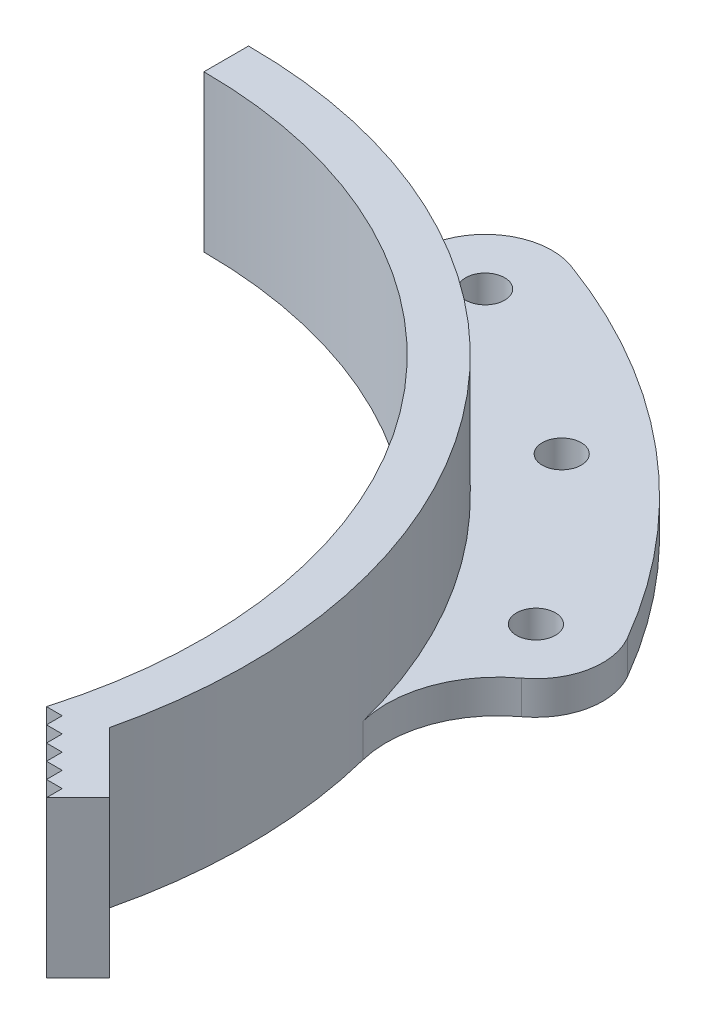
ISO-10303-21;
HEADER;
FILE_DESCRIPTION(('STEP AP214'),'2;1');
FILE_NAME('part.step','',(''),(''),'','','');
FILE_SCHEMA(('AUTOMOTIVE_DESIGN { 1 0 10303 214 1 1 1 1 }'));
ENDSEC;
DATA;
#1=APPLICATION_CONTEXT('core data for automotive mechanical design processes');
#2=APPLICATION_PROTOCOL_DEFINITION('international standard','automotive_design',2000,#1);
#3=PRODUCT_CONTEXT('',#1,'mechanical');
#4=PRODUCT('Part','Part','',(#3));
#5=PRODUCT_RELATED_PRODUCT_CATEGORY('part','',(#4));
#6=PRODUCT_DEFINITION_FORMATION('','',#4);
#7=PRODUCT_DEFINITION_CONTEXT('part definition',#1,'design');
#8=PRODUCT_DEFINITION('design','',#6,#7);
#9=PRODUCT_DEFINITION_SHAPE('','',#8);
#10=(LENGTH_UNIT() NAMED_UNIT(*) SI_UNIT(.MILLI.,.METRE.));
#11=(NAMED_UNIT(*) PLANE_ANGLE_UNIT() SI_UNIT($,.RADIAN.));
#12=(NAMED_UNIT(*) SI_UNIT($,.STERADIAN.) SOLID_ANGLE_UNIT());
#13=UNCERTAINTY_MEASURE_WITH_UNIT(LENGTH_MEASURE(1.E-05),#10,'distance_accuracy_value','');
#14=(GEOMETRIC_REPRESENTATION_CONTEXT(3) GLOBAL_UNCERTAINTY_ASSIGNED_CONTEXT((#13)) GLOBAL_UNIT_ASSIGNED_CONTEXT((#10,
#11,#12)) REPRESENTATION_CONTEXT('',''));
#15=CARTESIAN_POINT('',(0.,0.,0.));
#16=DIRECTION('',(0.,0.,1.));
#17=DIRECTION('',(1.,0.,0.));
#18=AXIS2_PLACEMENT_3D('',#15,#16,#17);
#19=CARTESIAN_POINT('',(0.,3.,0.));
#20=DIRECTION('',(0.,1.,0.));
#21=DIRECTION('',(0.,0.,1.));
#22=AXIS2_PLACEMENT_3D('',#19,#20,#21);
#23=PLANE('',#22);
#24=CARTESIAN_POINT('',(18.4690877395862,3.,-50.743401522439));
#25=DIRECTION('',(0.,1.,0.));
#26=DIRECTION('',(0.,0.,1.));
#27=AXIS2_PLACEMENT_3D('',#24,#25,#26);
#28=CIRCLE('',#27,1.75);
#29=CARTESIAN_POINT('',(18.4690877395862,3.,-48.993401522439));
#30=VERTEX_POINT('',#29);
#31=EDGE_CURVE('E311',#30,#30,#28,.T.);
#32=ORIENTED_EDGE('',*,*,#31,.F.);
#33=EDGE_LOOP('',(#32));
#34=FACE_BOUND('',#33,.T.);
#35=CARTESIAN_POINT('',(0.,3.,0.));
#36=DIRECTION('',(0.,-1.,0.));
#37=DIRECTION('',(0.,0.,1.));
#38=AXIS2_PLACEMENT_3D('',#35,#36,#37);
#39=CIRCLE('',#38,48.);
#40=CARTESIAN_POINT('',(0.,3.,-48.));
#41=VERTEX_POINT('',#40);
#42=CARTESIAN_POINT('',(46.5562232625086,3.,-11.6840949812748));
#43=VERTEX_POINT('',#42);
#44=EDGE_CURVE('E49',#41,#43,#39,.T.);
#45=ORIENTED_EDGE('',*,*,#44,.T.);
#46=CARTESIAN_POINT('',(56.2554364421979,3.,-14.1182814357071));
#47=DIRECTION('',(0.,1.,0.));
#48=DIRECTION('',(0.,0.,1.));
#49=AXIS2_PLACEMENT_3D('',#46,#47,#48);
#50=CIRCLE('',#49,10.);
#51=CARTESIAN_POINT('',(50.324146043549,3.,-22.1693555383902));
#52=VERTEX_POINT('',#51);
#53=EDGE_CURVE('E11',#43,#52,#50,.F.);
#54=ORIENTED_EDGE('',*,*,#53,.T.);
#55=CARTESIAN_POINT('',(46.7653718043596,3.,-27.0000000000001));
#56=DIRECTION('',(0.,1.,0.));
#57=DIRECTION('',(0.,0.,1.));
#58=AXIS2_PLACEMENT_3D('',#55,#56,#57);
#59=CIRCLE('',#58,6.);
#60=CARTESIAN_POINT('',(51.9615242270663,3.,-30.0000000000001));
#61=VERTEX_POINT('',#60);
#62=EDGE_CURVE('E324',#52,#61,#59,.T.);
#63=ORIENTED_EDGE('',*,*,#62,.T.);
#64=CARTESIAN_POINT('',(0.,3.,0.));
#65=DIRECTION('',(0.,1.,0.));
#66=DIRECTION('',(0.,0.,1.));
#67=AXIS2_PLACEMENT_3D('',#64,#65,#66);
#68=CIRCLE('',#67,60.);
#69=CARTESIAN_POINT('',(20.5212085995402,3.,-56.3815572471545));
#70=VERTEX_POINT('',#69);
#71=EDGE_CURVE('E327',#61,#70,#68,.T.);
#72=ORIENTED_EDGE('',*,*,#71,.T.);
#73=CARTESIAN_POINT('',(18.4690877395862,3.,-50.743401522439));
#74=DIRECTION('',(0.,1.,0.));
#75=DIRECTION('',(0.,0.,1.));
#76=AXIS2_PLACEMENT_3D('',#73,#74,#75);
#77=CIRCLE('',#76,6.);
#78=CARTESIAN_POINT('',(12.4748076536375,3.,-50.4814735720417));
#79=VERTEX_POINT('',#78);
#80=EDGE_CURVE('E329',#70,#79,#77,.T.);
#81=ORIENTED_EDGE('',*,*,#80,.T.);
#82=CARTESIAN_POINT('',(0.,3.,0.));
#83=DIRECTION('',(0.,1.,0.));
#84=DIRECTION('',(0.,0.,1.));
#85=AXIS2_PLACEMENT_3D('',#82,#83,#84);
#86=CIRCLE('',#85,52.);
#87=CARTESIAN_POINT('',(0.,3.,-52.));
#88=VERTEX_POINT('',#87);
#89=EDGE_CURVE('E331',#79,#88,#86,.T.);
#90=ORIENTED_EDGE('',*,*,#89,.T.);
#91=DIRECTION('',(0.,0.,1.));
#92=VECTOR('',#91,1.);
#93=CARTESIAN_POINT('',(0.,3.,-48.));
#94=LINE('',#93,#92);
#95=EDGE_CURVE('E333',#88,#41,#94,.T.);
#96=ORIENTED_EDGE('',*,*,#95,.T.);
#97=EDGE_LOOP('',(#45,#54,#63,#72,#81,#90,#96));
#98=FACE_BOUND('',#97,.T.);
#99=CARTESIAN_POINT('',(34.7105309230731,3.,-41.3663999284248));
#100=DIRECTION('',(0.,1.,0.));
#101=DIRECTION('',(0.,0.,1.));
#102=AXIS2_PLACEMENT_3D('',#99,#100,#101);
#103=CIRCLE('',#102,1.75);
#104=CARTESIAN_POINT('',(34.7105309230731,3.,-39.6163999284248));
#105=VERTEX_POINT('',#104);
#106=EDGE_CURVE('E317',#105,#105,#103,.T.);
#107=ORIENTED_EDGE('',*,*,#106,.F.);
#108=EDGE_LOOP('',(#107));
#109=FACE_BOUND('',#108,.T.);
#110=CARTESIAN_POINT('',(46.7653718043596,3.,-27.0000000000001));
#111=DIRECTION('',(0.,1.,0.));
#112=DIRECTION('',(0.,0.,1.));
#113=AXIS2_PLACEMENT_3D('',#110,#111,#112);
#114=CIRCLE('',#113,1.74999999999998);
#115=CARTESIAN_POINT('',(46.7653718043596,3.,-25.2500000000001));
#116=VERTEX_POINT('',#115);
#117=EDGE_CURVE('E305',#116,#116,#114,.T.);
#118=ORIENTED_EDGE('',*,*,#117,.F.);
#119=EDGE_LOOP('',(#118));
#120=FACE_BOUND('',#119,.T.);
#121=ADVANCED_FACE('F35',(#34,#98,#109,#120),#23,.T.);
#122=CARTESIAN_POINT('',(0.,0.,0.));
#123=DIRECTION('',(0.,1.,0.));
#124=DIRECTION('',(0.,0.,1.));
#125=AXIS2_PLACEMENT_3D('',#122,#123,#124);
#126=PLANE('',#125);
#127=CARTESIAN_POINT('',(46.7653718043596,0.,-27.0000000000001));
#128=DIRECTION('',(0.,1.,0.));
#129=DIRECTION('',(0.,0.,1.));
#130=AXIS2_PLACEMENT_3D('',#127,#128,#129);
#131=CIRCLE('',#130,6.);
#132=CARTESIAN_POINT('',(50.324146043549,0.,-22.1693555383902));
#133=VERTEX_POINT('',#132);
#134=CARTESIAN_POINT('',(51.9615242270663,0.,-30.0000000000001));
#135=VERTEX_POINT('',#134);
#136=EDGE_CURVE('E320',#133,#135,#131,.T.);
#137=ORIENTED_EDGE('',*,*,#136,.F.);
#138=CARTESIAN_POINT('',(56.2554364421979,0.,-14.1182814357071));
#139=DIRECTION('',(0.,1.,0.));
#140=DIRECTION('',(0.,0.,1.));
#141=AXIS2_PLACEMENT_3D('',#138,#139,#140);
#142=CIRCLE('',#141,10.);
#143=CARTESIAN_POINT('',(46.5562232625086,0.,-11.6840949812748));
#144=VERTEX_POINT('',#143);
#145=EDGE_CURVE('E43',#133,#144,#142,.T.);
#146=ORIENTED_EDGE('',*,*,#145,.T.);
#147=CARTESIAN_POINT('',(0.,0.,0.));
#148=DIRECTION('',(0.,1.,0.));
#149=DIRECTION('',(0.,0.,1.));
#150=AXIS2_PLACEMENT_3D('',#147,#148,#149);
#151=CIRCLE('',#150,48.);
#152=CARTESIAN_POINT('',(46.6876836873935,0.,11.1472055648891));
#153=VERTEX_POINT('',#152);
#154=EDGE_CURVE('E189',#153,#144,#151,.T.);
#155=ORIENTED_EDGE('',*,*,#154,.F.);
#156=DIRECTION('',(-0.707106781186548,0.,-0.707106781186547));
#157=VECTOR('',#156,1.);
#158=CARTESIAN_POINT('',(52.1312730888183,0.,16.590794966314));
#159=LINE('',#158,#157);
#160=CARTESIAN_POINT('',(52.1312730888183,0.,16.590794966314));
#161=VERTEX_POINT('',#160);
#162=EDGE_CURVE('E273',#161,#153,#159,.T.);
#163=ORIENTED_EDGE('',*,*,#162,.F.);
#164=DIRECTION('',(0.707106781186547,0.,-0.707106781186548));
#165=VECTOR('',#164,1.);
#166=CARTESIAN_POINT('',(49.3028459640721,0.,19.4192220910602));
#167=LINE('',#166,#165);
#168=CARTESIAN_POINT('',(49.3028459640721,0.,19.4192220910602));
#169=VERTEX_POINT('',#168);
#170=EDGE_CURVE('E270',#169,#161,#167,.T.);
#171=ORIENTED_EDGE('',*,*,#170,.F.);
#172=DIRECTION('',(0.,0.,1.));
#173=VECTOR('',#172,1.);
#174=CARTESIAN_POINT('',(49.3028459640721,0.,19.4192220910602));
#175=LINE('',#174,#173);
#176=CARTESIAN_POINT('',(49.3028459640721,0.,18.0050085286871));
#177=VERTEX_POINT('',#176);
#178=EDGE_CURVE('E267',#177,#169,#175,.T.);
#179=ORIENTED_EDGE('',*,*,#178,.F.);
#180=DIRECTION('',(1.,0.,0.));
#181=VECTOR('',#180,1.);
#182=CARTESIAN_POINT('',(49.3028459640721,0.,18.0050085286871));
#183=LINE('',#182,#181);
#184=CARTESIAN_POINT('',(47.888632401699,0.,18.0050085286871));
#185=VERTEX_POINT('',#184);
#186=EDGE_CURVE('E264',#185,#177,#183,.T.);
#187=ORIENTED_EDGE('',*,*,#186,.F.);
#188=DIRECTION('',(0.,0.,1.));
#189=VECTOR('',#188,1.);
#190=CARTESIAN_POINT('',(47.888632401699,0.,18.0050085286871));
#191=LINE('',#190,#189);
#192=CARTESIAN_POINT('',(47.888632401699,0.,16.590794966314));
#193=VERTEX_POINT('',#192);
#194=EDGE_CURVE('E261',#193,#185,#191,.T.);
#195=ORIENTED_EDGE('',*,*,#194,.F.);
#196=DIRECTION('',(1.,0.,0.));
#197=VECTOR('',#196,1.);
#198=CARTESIAN_POINT('',(47.888632401699,0.,16.590794966314));
#199=LINE('',#198,#197);
#200=CARTESIAN_POINT('',(46.474418839326,0.,16.590794966314));
#201=VERTEX_POINT('',#200);
#202=EDGE_CURVE('E258',#201,#193,#199,.T.);
#203=ORIENTED_EDGE('',*,*,#202,.F.);
#204=DIRECTION('',(0.,0.,1.));
#205=VECTOR('',#204,1.);
#206=CARTESIAN_POINT('',(46.474418839326,0.,16.590794966314));
#207=LINE('',#206,#205);
#208=CARTESIAN_POINT('',(46.474418839326,0.,15.1765814039409));
#209=VERTEX_POINT('',#208);
#210=EDGE_CURVE('E255',#209,#201,#207,.T.);
#211=ORIENTED_EDGE('',*,*,#210,.F.);
#212=DIRECTION('',(1.,0.,0.));
#213=VECTOR('',#212,1.);
#214=CARTESIAN_POINT('',(46.474418839326,0.,15.1765814039409));
#215=LINE('',#214,#213);
#216=CARTESIAN_POINT('',(45.0602052769529,0.,15.1765814039409));
#217=VERTEX_POINT('',#216);
#218=EDGE_CURVE('E252',#217,#209,#215,.T.);
#219=ORIENTED_EDGE('',*,*,#218,.F.);
#220=DIRECTION('',(0.,0.,1.));
#221=VECTOR('',#220,1.);
#222=CARTESIAN_POINT('',(45.0602052769529,0.,15.1765814039409));
#223=LINE('',#222,#221);
#224=CARTESIAN_POINT('',(45.0602052769529,0.,13.7623678415678));
#225=VERTEX_POINT('',#224);
#226=EDGE_CURVE('E249',#225,#217,#223,.T.);
#227=ORIENTED_EDGE('',*,*,#226,.F.);
#228=DIRECTION('',(1.,0.,0.));
#229=VECTOR('',#228,1.);
#230=CARTESIAN_POINT('',(45.0602052769529,0.,13.7623678415678));
#231=LINE('',#230,#229);
#232=CARTESIAN_POINT('',(43.6459917145798,0.,13.7623678415678));
#233=VERTEX_POINT('',#232);
#234=EDGE_CURVE('E246',#233,#225,#231,.T.);
#235=ORIENTED_EDGE('',*,*,#234,.F.);
#236=DIRECTION('',(0.,0.,1.));
#237=VECTOR('',#236,1.);
#238=CARTESIAN_POINT('',(43.6459917145798,0.,13.7623678415678));
#239=LINE('',#238,#237);
#240=CARTESIAN_POINT('',(43.6459917145798,0.,12.3481542791948));
#241=VERTEX_POINT('',#240);
#242=EDGE_CURVE('E243',#241,#233,#239,.T.);
#243=ORIENTED_EDGE('',*,*,#242,.F.);
#244=DIRECTION('',(1.,0.,0.));
#245=VECTOR('',#244,1.);
#246=CARTESIAN_POINT('',(43.6459917145798,0.,12.3481542791948));
#247=LINE('',#246,#245);
#248=CARTESIAN_POINT('',(42.2317781522067,0.,12.3481542791948));
#249=VERTEX_POINT('',#248);
#250=EDGE_CURVE('E241',#249,#241,#247,.T.);
#251=ORIENTED_EDGE('',*,*,#250,.F.);
#252=CARTESIAN_POINT('',(0.,0.,0.));
#253=DIRECTION('',(0.,-1.,0.));
#254=DIRECTION('',(0.,0.,1.));
#255=AXIS2_PLACEMENT_3D('',#252,#253,#254);
#256=CIRCLE('',#255,44.);
#257=CARTESIAN_POINT('',(0.,0.,-44.));
#258=VERTEX_POINT('',#257);
#259=EDGE_CURVE('E184',#258,#249,#256,.T.);
#260=ORIENTED_EDGE('',*,*,#259,.F.);
#261=DIRECTION('',(0.,0.,1.));
#262=VECTOR('',#261,1.);
#263=CARTESIAN_POINT('',(0.,0.,-48.));
#264=LINE('',#263,#262);
#265=CARTESIAN_POINT('',(0.,0.,-52.));
#266=VERTEX_POINT('',#265);
#267=EDGE_CURVE('E325',#266,#258,#264,.T.);
#268=ORIENTED_EDGE('',*,*,#267,.F.);
#269=CARTESIAN_POINT('',(0.,0.,0.));
#270=DIRECTION('',(0.,1.,0.));
#271=DIRECTION('',(0.,0.,1.));
#272=AXIS2_PLACEMENT_3D('',#269,#270,#271);
#273=CIRCLE('',#272,52.);
#274=CARTESIAN_POINT('',(12.4748076536375,0.,-50.4814735720417));
#275=VERTEX_POINT('',#274);
#276=EDGE_CURVE('E341',#275,#266,#273,.T.);
#277=ORIENTED_EDGE('',*,*,#276,.F.);
#278=CARTESIAN_POINT('',(18.4690877395862,0.,-50.743401522439));
#279=DIRECTION('',(0.,1.,0.));
#280=DIRECTION('',(0.,0.,1.));
#281=AXIS2_PLACEMENT_3D('',#278,#279,#280);
#282=CIRCLE('',#281,6.);
#283=CARTESIAN_POINT('',(20.5212085995402,0.,-56.3815572471545));
#284=VERTEX_POINT('',#283);
#285=EDGE_CURVE('E339',#284,#275,#282,.T.);
#286=ORIENTED_EDGE('',*,*,#285,.F.);
#287=CARTESIAN_POINT('',(0.,0.,0.));
#288=DIRECTION('',(0.,1.,0.));
#289=DIRECTION('',(0.,0.,1.));
#290=AXIS2_PLACEMENT_3D('',#287,#288,#289);
#291=CIRCLE('',#290,60.);
#292=EDGE_CURVE('E337',#135,#284,#291,.T.);
#293=ORIENTED_EDGE('',*,*,#292,.F.);
#294=EDGE_LOOP('',(#137,#146,#155,#163,#171,#179,#187,#195,#203,#211,#219,#227,#235,#243,#251,
#260,#268,#277,#286,#293));
#295=FACE_BOUND('',#294,.T.);
#296=CARTESIAN_POINT('',(34.7105309230731,0.,-41.3663999284248));
#297=DIRECTION('',(0.,1.,0.));
#298=DIRECTION('',(0.,0.,1.));
#299=AXIS2_PLACEMENT_3D('',#296,#297,#298);
#300=CIRCLE('',#299,1.75);
#301=CARTESIAN_POINT('',(34.7105309230731,0.,-39.6163999284248));
#302=VERTEX_POINT('',#301);
#303=EDGE_CURVE('E314',#302,#302,#300,.T.);
#304=ORIENTED_EDGE('',*,*,#303,.T.);
#305=EDGE_LOOP('',(#304));
#306=FACE_BOUND('',#305,.T.);
#307=CARTESIAN_POINT('',(18.4690877395862,0.,-50.743401522439));
#308=DIRECTION('',(0.,1.,0.));
#309=DIRECTION('',(0.,0.,1.));
#310=AXIS2_PLACEMENT_3D('',#307,#308,#309);
#311=CIRCLE('',#310,1.75);
#312=CARTESIAN_POINT('',(18.4690877395862,0.,-48.993401522439));
#313=VERTEX_POINT('',#312);
#314=EDGE_CURVE('E308',#313,#313,#311,.T.);
#315=ORIENTED_EDGE('',*,*,#314,.T.);
#316=EDGE_LOOP('',(#315));
#317=FACE_BOUND('',#316,.T.);
#318=CARTESIAN_POINT('',(46.7653718043596,0.,-27.0000000000001));
#319=DIRECTION('',(0.,1.,0.));
#320=DIRECTION('',(0.,0.,1.));
#321=AXIS2_PLACEMENT_3D('',#318,#319,#320);
#322=CIRCLE('',#321,1.74999999999998);
#323=CARTESIAN_POINT('',(46.7653718043596,0.,-25.2500000000001));
#324=VERTEX_POINT('',#323);
#325=EDGE_CURVE('E279',#324,#324,#322,.T.);
#326=ORIENTED_EDGE('',*,*,#325,.T.);
#327=EDGE_LOOP('',(#326));
#328=FACE_BOUND('',#327,.T.);
#329=ADVANCED_FACE('F396',(#295,#306,#317,#328),#126,.F.);
#330=CARTESIAN_POINT('',(46.7653718043596,3.,-27.0000000000001));
#331=DIRECTION('',(0.,-1.,0.));
#332=DIRECTION('',(0.,0.,-1.));
#333=AXIS2_PLACEMENT_3D('',#330,#331,#332);
#334=CYLINDRICAL_SURFACE('',#333,6.);
#335=ORIENTED_EDGE('',*,*,#62,.F.);
#336=DIRECTION('',(0.,-1.,0.));
#337=VECTOR('',#336,1.);
#338=CARTESIAN_POINT('',(50.324146043549,3.,-22.1693555383902));
#339=LINE('',#338,#337);
#340=EDGE_CURVE('E355',#52,#133,#339,.T.);
#341=ORIENTED_EDGE('',*,*,#340,.T.);
#342=ORIENTED_EDGE('',*,*,#136,.T.);
#343=DIRECTION('',(0.,-1.,0.));
#344=VECTOR('',#343,1.);
#345=CARTESIAN_POINT('',(51.9615242270663,3.,-30.0000000000001));
#346=LINE('',#345,#344);
#347=EDGE_CURVE('E352',#61,#135,#346,.T.);
#348=ORIENTED_EDGE('',*,*,#347,.F.);
#349=EDGE_LOOP('',(#335,#341,#342,#348));
#350=FACE_BOUND('',#349,.T.);
#351=ADVANCED_FACE('F370',(#350),#334,.T.);
#352=CARTESIAN_POINT('',(0.,3.,0.));
#353=DIRECTION('',(0.,-1.,0.));
#354=DIRECTION('',(0.,0.,-1.));
#355=AXIS2_PLACEMENT_3D('',#352,#353,#354);
#356=CYLINDRICAL_SURFACE('',#355,60.);
#357=ORIENTED_EDGE('',*,*,#292,.T.);
#358=DIRECTION('',(0.,-1.,0.));
#359=VECTOR('',#358,1.);
#360=CARTESIAN_POINT('',(20.5212085995402,3.,-56.3815572471545));
#361=LINE('',#360,#359);
#362=EDGE_CURVE('E349',#70,#284,#361,.T.);
#363=ORIENTED_EDGE('',*,*,#362,.F.);
#364=ORIENTED_EDGE('',*,*,#71,.F.);
#365=ORIENTED_EDGE('',*,*,#347,.T.);
#366=EDGE_LOOP('',(#357,#363,#364,#365));
#367=FACE_BOUND('',#366,.T.);
#368=ADVANCED_FACE('F375',(#367),#356,.T.);
#369=CARTESIAN_POINT('',(18.4690877395862,3.,-50.743401522439));
#370=DIRECTION('',(0.,-1.,0.));
#371=DIRECTION('',(0.,0.,-1.));
#372=AXIS2_PLACEMENT_3D('',#369,#370,#371);
#373=CYLINDRICAL_SURFACE('',#372,6.);
#374=ORIENTED_EDGE('',*,*,#285,.T.);
#375=DIRECTION('',(0.,-1.,0.));
#376=VECTOR('',#375,1.);
#377=CARTESIAN_POINT('',(12.4748076536375,3.,-50.4814735720417));
#378=LINE('',#377,#376);
#379=EDGE_CURVE('E346',#79,#275,#378,.T.);
#380=ORIENTED_EDGE('',*,*,#379,.F.);
#381=ORIENTED_EDGE('',*,*,#80,.F.);
#382=ORIENTED_EDGE('',*,*,#362,.T.);
#383=EDGE_LOOP('',(#374,#380,#381,#382));
#384=FACE_BOUND('',#383,.T.);
#385=ADVANCED_FACE('F381',(#384),#373,.T.);
#386=CARTESIAN_POINT('',(0.,3.,0.));
#387=DIRECTION('',(0.,-1.,0.));
#388=DIRECTION('',(0.,0.,-1.));
#389=AXIS2_PLACEMENT_3D('',#386,#387,#388);
#390=CYLINDRICAL_SURFACE('',#389,52.);
#391=ORIENTED_EDGE('',*,*,#276,.T.);
#392=DIRECTION('',(0.,-1.,0.));
#393=VECTOR('',#392,1.);
#394=CARTESIAN_POINT('',(0.,3.,-52.));
#395=LINE('',#394,#393);
#396=EDGE_CURVE('E335',#88,#266,#395,.T.);
#397=ORIENTED_EDGE('',*,*,#396,.F.);
#398=ORIENTED_EDGE('',*,*,#89,.F.);
#399=ORIENTED_EDGE('',*,*,#379,.T.);
#400=EDGE_LOOP('',(#391,#397,#398,#399));
#401=FACE_BOUND('',#400,.T.);
#402=ADVANCED_FACE('F385',(#401),#390,.T.);
#403=CARTESIAN_POINT('',(0.,3.,-48.));
#404=DIRECTION('',(1.,0.,0.));
#405=DIRECTION('',(0.,0.,-1.));
#406=AXIS2_PLACEMENT_3D('',#403,#404,#405);
#407=PLANE('',#406);
#408=ORIENTED_EDGE('',*,*,#267,.T.);
#409=DIRECTION('',(0.,1.,0.));
#410=VECTOR('',#409,1.);
#411=CARTESIAN_POINT('',(0.,0.,-44.));
#412=LINE('',#411,#410);
#413=CARTESIAN_POINT('',(0.,14.,-44.));
#414=VERTEX_POINT('',#413);
#415=EDGE_CURVE('E277',#258,#414,#412,.T.);
#416=ORIENTED_EDGE('',*,*,#415,.T.);
#417=DIRECTION('',(0.,0.,1.));
#418=VECTOR('',#417,1.);
#419=CARTESIAN_POINT('',(0.,14.,-44.));
#420=LINE('',#419,#418);
#421=CARTESIAN_POINT('',(0.,14.,-48.));
#422=VERTEX_POINT('',#421);
#423=EDGE_CURVE('E203',#422,#414,#420,.T.);
#424=ORIENTED_EDGE('',*,*,#423,.F.);
#425=DIRECTION('',(0.,1.,0.));
#426=VECTOR('',#425,1.);
#427=CARTESIAN_POINT('',(0.,0.,-48.));
#428=LINE('',#427,#426);
#429=EDGE_CURVE('E280',#41,#422,#428,.T.);
#430=ORIENTED_EDGE('',*,*,#429,.F.);
#431=ORIENTED_EDGE('',*,*,#95,.F.);
#432=ORIENTED_EDGE('',*,*,#396,.T.);
#433=EDGE_LOOP('',(#408,#416,#424,#430,#431,#432));
#434=FACE_BOUND('',#433,.T.);
#435=ADVANCED_FACE('F389',(#434),#407,.F.);
#436=CARTESIAN_POINT('',(34.7105309230731,3.,-41.3663999284248));
#437=DIRECTION('',(0.,-1.,0.));
#438=DIRECTION('',(0.,0.,-1.));
#439=AXIS2_PLACEMENT_3D('',#436,#437,#438);
#440=CYLINDRICAL_SURFACE('',#439,1.75);
#441=ORIENTED_EDGE('',*,*,#106,.T.);
#442=EDGE_LOOP('',(#441));
#443=FACE_BOUND('',#442,.T.);
#444=ORIENTED_EDGE('',*,*,#303,.F.);
#445=EDGE_LOOP('',(#444));
#446=FACE_BOUND('',#445,.T.);
#447=ADVANCED_FACE('F453',(#443,#446),#440,.F.);
#448=CARTESIAN_POINT('',(18.4690877395862,3.,-50.743401522439));
#449=DIRECTION('',(0.,-1.,0.));
#450=DIRECTION('',(0.,0.,-1.));
#451=AXIS2_PLACEMENT_3D('',#448,#449,#450);
#452=CYLINDRICAL_SURFACE('',#451,1.75);
#453=ORIENTED_EDGE('',*,*,#31,.T.);
#454=EDGE_LOOP('',(#453));
#455=FACE_BOUND('',#454,.T.);
#456=ORIENTED_EDGE('',*,*,#314,.F.);
#457=EDGE_LOOP('',(#456));
#458=FACE_BOUND('',#457,.T.);
#459=ADVANCED_FACE('F493',(#455,#458),#452,.F.);
#460=CARTESIAN_POINT('',(46.7653718043596,3.,-27.0000000000001));
#461=DIRECTION('',(0.,-1.,0.));
#462=DIRECTION('',(0.,0.,-1.));
#463=AXIS2_PLACEMENT_3D('',#460,#461,#462);
#464=CYLINDRICAL_SURFACE('',#463,1.74999999999998);
#465=ORIENTED_EDGE('',*,*,#117,.T.);
#466=EDGE_LOOP('',(#465));
#467=FACE_BOUND('',#466,.T.);
#468=ORIENTED_EDGE('',*,*,#325,.F.);
#469=EDGE_LOOP('',(#468));
#470=FACE_BOUND('',#469,.T.);
#471=ADVANCED_FACE('F500',(#467,#470),#464,.F.);
#472=CARTESIAN_POINT('',(0.,0.,0.));
#473=DIRECTION('',(0.,1.,0.));
#474=DIRECTION('',(0.,0.,1.));
#475=AXIS2_PLACEMENT_3D('',#472,#473,#474);
#476=CYLINDRICAL_SURFACE('',#475,44.);
#477=DIRECTION('',(0.,1.,0.));
#478=VECTOR('',#477,1.);
#479=CARTESIAN_POINT('',(42.2317781522067,0.,12.3481542791948));
#480=LINE('',#479,#478);
#481=CARTESIAN_POINT('',(42.2317781522067,14.,12.3481542791948));
#482=VERTEX_POINT('',#481);
#483=EDGE_CURVE('E177',#249,#482,#480,.T.);
#484=ORIENTED_EDGE('',*,*,#483,.T.);
#485=CARTESIAN_POINT('',(0.,14.,0.));
#486=DIRECTION('',(0.,-1.,0.));
#487=DIRECTION('',(0.,0.,1.));
#488=AXIS2_PLACEMENT_3D('',#485,#486,#487);
#489=CIRCLE('',#488,44.);
#490=EDGE_CURVE('E182',#414,#482,#489,.T.);
#491=ORIENTED_EDGE('',*,*,#490,.F.);
#492=ORIENTED_EDGE('',*,*,#415,.F.);
#493=ORIENTED_EDGE('',*,*,#259,.T.);
#494=EDGE_LOOP('',(#484,#491,#492,#493));
#495=FACE_BOUND('',#494,.T.);
#496=ADVANCED_FACE('F179',(#495),#476,.F.);
#497=CARTESIAN_POINT('',(0.,0.,0.));
#498=DIRECTION('',(0.,1.,0.));
#499=DIRECTION('',(0.,0.,1.));
#500=AXIS2_PLACEMENT_3D('',#497,#498,#499);
#501=CYLINDRICAL_SURFACE('',#500,48.);
#502=ORIENTED_EDGE('',*,*,#154,.T.);
#503=DIRECTION('',(0.,1.,0.));
#504=VECTOR('',#503,1.);
#505=CARTESIAN_POINT('',(46.5562232625086,0.,-11.6840949812748));
#506=LINE('',#505,#504);
#507=EDGE_CURVE('E358',#144,#43,#506,.T.);
#508=ORIENTED_EDGE('',*,*,#507,.T.);
#509=ORIENTED_EDGE('',*,*,#44,.F.);
#510=ORIENTED_EDGE('',*,*,#429,.T.);
#511=CARTESIAN_POINT('',(0.,14.,0.));
#512=DIRECTION('',(0.,1.,0.));
#513=DIRECTION('',(0.,0.,1.));
#514=AXIS2_PLACEMENT_3D('',#511,#512,#513);
#515=CIRCLE('',#514,48.);
#516=CARTESIAN_POINT('',(46.6876836873935,14.,11.1472055648891));
#517=VERTEX_POINT('',#516);
#518=EDGE_CURVE('E237',#517,#422,#515,.T.);
#519=ORIENTED_EDGE('',*,*,#518,.F.);
#520=DIRECTION('',(0.,1.,0.));
#521=VECTOR('',#520,1.);
#522=CARTESIAN_POINT('',(46.6876836873935,0.,11.1472055648891));
#523=LINE('',#522,#521);
#524=EDGE_CURVE('E282',#153,#517,#523,.T.);
#525=ORIENTED_EDGE('',*,*,#524,.F.);
#526=EDGE_LOOP('',(#502,#508,#509,#510,#519,#525));
#527=FACE_BOUND('',#526,.T.);
#528=ADVANCED_FACE('F362',(#527),#501,.T.);
#529=CARTESIAN_POINT('',(52.1312730888183,0.,16.590794966314));
#530=DIRECTION('',(0.707106781186547,0.,-0.707106781186548));
#531=DIRECTION('',(-0.707106781186548,0.,-0.707106781186547));
#532=AXIS2_PLACEMENT_3D('',#529,#530,#531);
#533=PLANE('',#532);
#534=ORIENTED_EDGE('',*,*,#524,.T.);
#535=DIRECTION('',(-0.707106781186548,0.,-0.707106781186547));
#536=VECTOR('',#535,1.);
#537=CARTESIAN_POINT('',(52.1312730888183,14.,16.590794966314));
#538=LINE('',#537,#536);
#539=CARTESIAN_POINT('',(52.1312730888183,14.,16.590794966314));
#540=VERTEX_POINT('',#539);
#541=EDGE_CURVE('E234',#540,#517,#538,.T.);
#542=ORIENTED_EDGE('',*,*,#541,.F.);
#543=DIRECTION('',(0.,1.,0.));
#544=VECTOR('',#543,1.);
#545=CARTESIAN_POINT('',(52.1312730888183,0.,16.590794966314));
#546=LINE('',#545,#544);
#547=EDGE_CURVE('E284',#161,#540,#546,.T.);
#548=ORIENTED_EDGE('',*,*,#547,.F.);
#549=ORIENTED_EDGE('',*,*,#162,.T.);
#550=EDGE_LOOP('',(#534,#542,#548,#549));
#551=FACE_BOUND('',#550,.T.);
#552=ADVANCED_FACE('F394',(#551),#533,.T.);
#553=CARTESIAN_POINT('',(49.3028459640721,0.,19.4192220910602));
#554=DIRECTION('',(0.707106781186548,0.,0.707106781186547));
#555=DIRECTION('',(0.707106781186547,0.,-0.707106781186548));
#556=AXIS2_PLACEMENT_3D('',#553,#554,#555);
#557=PLANE('',#556);
#558=ORIENTED_EDGE('',*,*,#547,.T.);
#559=DIRECTION('',(0.707106781186547,0.,-0.707106781186548));
#560=VECTOR('',#559,1.);
#561=CARTESIAN_POINT('',(49.3028459640721,14.,19.4192220910602));
#562=LINE('',#561,#560);
#563=CARTESIAN_POINT('',(49.3028459640721,14.,19.4192220910602));
#564=VERTEX_POINT('',#563);
#565=EDGE_CURVE('E231',#564,#540,#562,.T.);
#566=ORIENTED_EDGE('',*,*,#565,.F.);
#567=DIRECTION('',(0.,1.,0.));
#568=VECTOR('',#567,1.);
#569=CARTESIAN_POINT('',(49.3028459640721,0.,19.4192220910602));
#570=LINE('',#569,#568);
#571=EDGE_CURVE('E286',#169,#564,#570,.T.);
#572=ORIENTED_EDGE('',*,*,#571,.F.);
#573=ORIENTED_EDGE('',*,*,#170,.T.);
#574=EDGE_LOOP('',(#558,#566,#572,#573));
#575=FACE_BOUND('',#574,.T.);
#576=ADVANCED_FACE('F401',(#575),#557,.T.);
#577=CARTESIAN_POINT('',(49.3028459640721,0.,19.4192220910602));
#578=DIRECTION('',(-1.,0.,0.));
#579=DIRECTION('',(0.,0.,1.));
#580=AXIS2_PLACEMENT_3D('',#577,#578,#579);
#581=PLANE('',#580);
#582=ORIENTED_EDGE('',*,*,#571,.T.);
#583=DIRECTION('',(0.,0.,1.));
#584=VECTOR('',#583,1.);
#585=CARTESIAN_POINT('',(49.3028459640721,14.,19.4192220910602));
#586=LINE('',#585,#584);
#587=CARTESIAN_POINT('',(49.3028459640721,14.,18.0050085286871));
#588=VERTEX_POINT('',#587);
#589=EDGE_CURVE('E228',#588,#564,#586,.T.);
#590=ORIENTED_EDGE('',*,*,#589,.F.);
#591=DIRECTION('',(0.,1.,0.));
#592=VECTOR('',#591,1.);
#593=CARTESIAN_POINT('',(49.3028459640721,0.,18.0050085286871));
#594=LINE('',#593,#592);
#595=EDGE_CURVE('E288',#177,#588,#594,.T.);
#596=ORIENTED_EDGE('',*,*,#595,.F.);
#597=ORIENTED_EDGE('',*,*,#178,.T.);
#598=EDGE_LOOP('',(#582,#590,#596,#597));
#599=FACE_BOUND('',#598,.T.);
#600=ADVANCED_FACE('F404',(#599),#581,.T.);
#601=CARTESIAN_POINT('',(49.3028459640721,0.,18.0050085286871));
#602=DIRECTION('',(0.,0.,1.));
#603=DIRECTION('',(1.,0.,0.));
#604=AXIS2_PLACEMENT_3D('',#601,#602,#603);
#605=PLANE('',#604);
#606=ORIENTED_EDGE('',*,*,#595,.T.);
#607=DIRECTION('',(1.,0.,0.));
#608=VECTOR('',#607,1.);
#609=CARTESIAN_POINT('',(49.3028459640721,14.,18.0050085286871));
#610=LINE('',#609,#608);
#611=CARTESIAN_POINT('',(47.888632401699,14.,18.0050085286871));
#612=VERTEX_POINT('',#611);
#613=EDGE_CURVE('E225',#612,#588,#610,.T.);
#614=ORIENTED_EDGE('',*,*,#613,.F.);
#615=DIRECTION('',(0.,1.,0.));
#616=VECTOR('',#615,1.);
#617=CARTESIAN_POINT('',(47.888632401699,0.,18.0050085286871));
#618=LINE('',#617,#616);
#619=EDGE_CURVE('E290',#185,#612,#618,.T.);
#620=ORIENTED_EDGE('',*,*,#619,.F.);
#621=ORIENTED_EDGE('',*,*,#186,.T.);
#622=EDGE_LOOP('',(#606,#614,#620,#621));
#623=FACE_BOUND('',#622,.T.);
#624=ADVANCED_FACE('F408',(#623),#605,.T.);
#625=CARTESIAN_POINT('',(47.888632401699,0.,18.0050085286871));
#626=DIRECTION('',(-1.,0.,0.));
#627=DIRECTION('',(0.,0.,1.));
#628=AXIS2_PLACEMENT_3D('',#625,#626,#627);
#629=PLANE('',#628);
#630=ORIENTED_EDGE('',*,*,#619,.T.);
#631=DIRECTION('',(0.,0.,1.));
#632=VECTOR('',#631,1.);
#633=CARTESIAN_POINT('',(47.888632401699,14.,18.0050085286871));
#634=LINE('',#633,#632);
#635=CARTESIAN_POINT('',(47.888632401699,14.,16.590794966314));
#636=VERTEX_POINT('',#635);
#637=EDGE_CURVE('E222',#636,#612,#634,.T.);
#638=ORIENTED_EDGE('',*,*,#637,.F.);
#639=DIRECTION('',(0.,1.,0.));
#640=VECTOR('',#639,1.);
#641=CARTESIAN_POINT('',(47.888632401699,0.,16.590794966314));
#642=LINE('',#641,#640);
#643=EDGE_CURVE('E292',#193,#636,#642,.T.);
#644=ORIENTED_EDGE('',*,*,#643,.F.);
#645=ORIENTED_EDGE('',*,*,#194,.T.);
#646=EDGE_LOOP('',(#630,#638,#644,#645));
#647=FACE_BOUND('',#646,.T.);
#648=ADVANCED_FACE('F413',(#647),#629,.T.);
#649=CARTESIAN_POINT('',(47.888632401699,0.,16.590794966314));
#650=DIRECTION('',(0.,0.,1.));
#651=DIRECTION('',(1.,0.,0.));
#652=AXIS2_PLACEMENT_3D('',#649,#650,#651);
#653=PLANE('',#652);
#654=ORIENTED_EDGE('',*,*,#643,.T.);
#655=DIRECTION('',(1.,0.,0.));
#656=VECTOR('',#655,1.);
#657=CARTESIAN_POINT('',(47.888632401699,14.,16.590794966314));
#658=LINE('',#657,#656);
#659=CARTESIAN_POINT('',(46.474418839326,14.,16.590794966314));
#660=VERTEX_POINT('',#659);
#661=EDGE_CURVE('E219',#660,#636,#658,.T.);
#662=ORIENTED_EDGE('',*,*,#661,.F.);
#663=DIRECTION('',(0.,1.,0.));
#664=VECTOR('',#663,1.);
#665=CARTESIAN_POINT('',(46.474418839326,0.,16.590794966314));
#666=LINE('',#665,#664);
#667=EDGE_CURVE('E294',#201,#660,#666,.T.);
#668=ORIENTED_EDGE('',*,*,#667,.F.);
#669=ORIENTED_EDGE('',*,*,#202,.T.);
#670=EDGE_LOOP('',(#654,#662,#668,#669));
#671=FACE_BOUND('',#670,.T.);
#672=ADVANCED_FACE('F416',(#671),#653,.T.);
#673=CARTESIAN_POINT('',(46.474418839326,0.,16.590794966314));
#674=DIRECTION('',(-1.,0.,0.));
#675=DIRECTION('',(0.,0.,1.));
#676=AXIS2_PLACEMENT_3D('',#673,#674,#675);
#677=PLANE('',#676);
#678=ORIENTED_EDGE('',*,*,#667,.T.);
#679=DIRECTION('',(0.,0.,1.));
#680=VECTOR('',#679,1.);
#681=CARTESIAN_POINT('',(46.474418839326,14.,16.590794966314));
#682=LINE('',#681,#680);
#683=CARTESIAN_POINT('',(46.474418839326,14.,15.1765814039409));
#684=VERTEX_POINT('',#683);
#685=EDGE_CURVE('E216',#684,#660,#682,.T.);
#686=ORIENTED_EDGE('',*,*,#685,.F.);
#687=DIRECTION('',(0.,1.,0.));
#688=VECTOR('',#687,1.);
#689=CARTESIAN_POINT('',(46.474418839326,0.,15.1765814039409));
#690=LINE('',#689,#688);
#691=EDGE_CURVE('E296',#209,#684,#690,.T.);
#692=ORIENTED_EDGE('',*,*,#691,.F.);
#693=ORIENTED_EDGE('',*,*,#210,.T.);
#694=EDGE_LOOP('',(#678,#686,#692,#693));
#695=FACE_BOUND('',#694,.T.);
#696=ADVANCED_FACE('F420',(#695),#677,.T.);
#697=CARTESIAN_POINT('',(46.474418839326,0.,15.1765814039409));
#698=DIRECTION('',(0.,0.,1.));
#699=DIRECTION('',(1.,0.,0.));
#700=AXIS2_PLACEMENT_3D('',#697,#698,#699);
#701=PLANE('',#700);
#702=ORIENTED_EDGE('',*,*,#691,.T.);
#703=DIRECTION('',(1.,0.,0.));
#704=VECTOR('',#703,1.);
#705=CARTESIAN_POINT('',(46.474418839326,14.,15.1765814039409));
#706=LINE('',#705,#704);
#707=CARTESIAN_POINT('',(45.0602052769529,14.,15.1765814039409));
#708=VERTEX_POINT('',#707);
#709=EDGE_CURVE('E213',#708,#684,#706,.T.);
#710=ORIENTED_EDGE('',*,*,#709,.F.);
#711=DIRECTION('',(0.,1.,0.));
#712=VECTOR('',#711,1.);
#713=CARTESIAN_POINT('',(45.0602052769529,0.,15.1765814039409));
#714=LINE('',#713,#712);
#715=EDGE_CURVE('E298',#217,#708,#714,.T.);
#716=ORIENTED_EDGE('',*,*,#715,.F.);
#717=ORIENTED_EDGE('',*,*,#218,.T.);
#718=EDGE_LOOP('',(#702,#710,#716,#717));
#719=FACE_BOUND('',#718,.T.);
#720=ADVANCED_FACE('F425',(#719),#701,.T.);
#721=CARTESIAN_POINT('',(45.0602052769529,0.,15.1765814039409));
#722=DIRECTION('',(-1.,0.,0.));
#723=DIRECTION('',(0.,0.,1.));
#724=AXIS2_PLACEMENT_3D('',#721,#722,#723);
#725=PLANE('',#724);
#726=ORIENTED_EDGE('',*,*,#715,.T.);
#727=DIRECTION('',(0.,0.,1.));
#728=VECTOR('',#727,1.);
#729=CARTESIAN_POINT('',(45.0602052769529,14.,15.1765814039409));
#730=LINE('',#729,#728);
#731=CARTESIAN_POINT('',(45.0602052769529,14.,13.7623678415678));
#732=VERTEX_POINT('',#731);
#733=EDGE_CURVE('E210',#732,#708,#730,.T.);
#734=ORIENTED_EDGE('',*,*,#733,.F.);
#735=DIRECTION('',(0.,1.,0.));
#736=VECTOR('',#735,1.);
#737=CARTESIAN_POINT('',(45.0602052769529,0.,13.7623678415678));
#738=LINE('',#737,#736);
#739=EDGE_CURVE('E300',#225,#732,#738,.T.);
#740=ORIENTED_EDGE('',*,*,#739,.F.);
#741=ORIENTED_EDGE('',*,*,#226,.T.);
#742=EDGE_LOOP('',(#726,#734,#740,#741));
#743=FACE_BOUND('',#742,.T.);
#744=ADVANCED_FACE('F428',(#743),#725,.T.);
#745=CARTESIAN_POINT('',(45.0602052769529,0.,13.7623678415678));
#746=DIRECTION('',(0.,0.,1.));
#747=DIRECTION('',(1.,0.,0.));
#748=AXIS2_PLACEMENT_3D('',#745,#746,#747);
#749=PLANE('',#748);
#750=ORIENTED_EDGE('',*,*,#739,.T.);
#751=DIRECTION('',(1.,0.,0.));
#752=VECTOR('',#751,1.);
#753=CARTESIAN_POINT('',(45.0602052769529,14.,13.7623678415678));
#754=LINE('',#753,#752);
#755=CARTESIAN_POINT('',(43.6459917145798,14.,13.7623678415678));
#756=VERTEX_POINT('',#755);
#757=EDGE_CURVE('E207',#756,#732,#754,.T.);
#758=ORIENTED_EDGE('',*,*,#757,.F.);
#759=DIRECTION('',(0.,1.,0.));
#760=VECTOR('',#759,1.);
#761=CARTESIAN_POINT('',(43.6459917145798,0.,13.7623678415678));
#762=LINE('',#761,#760);
#763=EDGE_CURVE('E302',#233,#756,#762,.T.);
#764=ORIENTED_EDGE('',*,*,#763,.F.);
#765=ORIENTED_EDGE('',*,*,#234,.T.);
#766=EDGE_LOOP('',(#750,#758,#764,#765));
#767=FACE_BOUND('',#766,.T.);
#768=ADVANCED_FACE('F431',(#767),#749,.T.);
#769=CARTESIAN_POINT('',(43.6459917145798,0.,13.7623678415678));
#770=DIRECTION('',(-1.,0.,0.));
#771=DIRECTION('',(0.,0.,1.));
#772=AXIS2_PLACEMENT_3D('',#769,#770,#771);
#773=PLANE('',#772);
#774=ORIENTED_EDGE('',*,*,#763,.T.);
#775=DIRECTION('',(0.,0.,1.));
#776=VECTOR('',#775,1.);
#777=CARTESIAN_POINT('',(43.6459917145798,14.,13.7623678415678));
#778=LINE('',#777,#776);
#779=CARTESIAN_POINT('',(43.6459917145798,14.,12.3481542791948));
#780=VERTEX_POINT('',#779);
#781=EDGE_CURVE('E197',#780,#756,#778,.T.);
#782=ORIENTED_EDGE('',*,*,#781,.F.);
#783=DIRECTION('',(0.,1.,0.));
#784=VECTOR('',#783,1.);
#785=CARTESIAN_POINT('',(43.6459917145798,0.,12.3481542791948));
#786=LINE('',#785,#784);
#787=EDGE_CURVE('E188',#241,#780,#786,.T.);
#788=ORIENTED_EDGE('',*,*,#787,.F.);
#789=ORIENTED_EDGE('',*,*,#242,.T.);
#790=EDGE_LOOP('',(#774,#782,#788,#789));
#791=FACE_BOUND('',#790,.T.);
#792=ADVANCED_FACE('F435',(#791),#773,.T.);
#793=CARTESIAN_POINT('',(43.6459917145798,0.,12.3481542791948));
#794=DIRECTION('',(0.,0.,1.));
#795=DIRECTION('',(1.,0.,0.));
#796=AXIS2_PLACEMENT_3D('',#793,#794,#795);
#797=PLANE('',#796);
#798=ORIENTED_EDGE('',*,*,#787,.T.);
#799=DIRECTION('',(1.,0.,0.));
#800=VECTOR('',#799,1.);
#801=CARTESIAN_POINT('',(43.6459917145798,14.,12.3481542791948));
#802=LINE('',#801,#800);
#803=EDGE_CURVE('E192',#482,#780,#802,.T.);
#804=ORIENTED_EDGE('',*,*,#803,.F.);
#805=ORIENTED_EDGE('',*,*,#483,.F.);
#806=ORIENTED_EDGE('',*,*,#250,.T.);
#807=EDGE_LOOP('',(#798,#804,#805,#806));
#808=FACE_BOUND('',#807,.T.);
#809=ADVANCED_FACE('F193',(#808),#797,.T.);
#810=CARTESIAN_POINT('',(0.,14.,0.));
#811=DIRECTION('',(0.,1.,0.));
#812=DIRECTION('',(0.,0.,1.));
#813=AXIS2_PLACEMENT_3D('',#810,#811,#812);
#814=PLANE('',#813);
#815=ORIENTED_EDGE('',*,*,#490,.T.);
#816=ORIENTED_EDGE('',*,*,#803,.T.);
#817=ORIENTED_EDGE('',*,*,#781,.T.);
#818=ORIENTED_EDGE('',*,*,#757,.T.);
#819=ORIENTED_EDGE('',*,*,#733,.T.);
#820=ORIENTED_EDGE('',*,*,#709,.T.);
#821=ORIENTED_EDGE('',*,*,#685,.T.);
#822=ORIENTED_EDGE('',*,*,#661,.T.);
#823=ORIENTED_EDGE('',*,*,#637,.T.);
#824=ORIENTED_EDGE('',*,*,#613,.T.);
#825=ORIENTED_EDGE('',*,*,#589,.T.);
#826=ORIENTED_EDGE('',*,*,#565,.T.);
#827=ORIENTED_EDGE('',*,*,#541,.T.);
#828=ORIENTED_EDGE('',*,*,#518,.T.);
#829=ORIENTED_EDGE('',*,*,#423,.T.);
#830=EDGE_LOOP('',(#815,#816,#817,#818,#819,#820,#821,#822,#823,#824,#825,#826,#827,#828,#829));
#831=FACE_BOUND('',#830,.T.);
#832=ADVANCED_FACE('F200',(#831),#814,.T.);
#833=CARTESIAN_POINT('',(56.2554364421979,0.,-14.1182814357071));
#834=DIRECTION('',(0.,1.,0.));
#835=DIRECTION('',(0.,0.,1.));
#836=AXIS2_PLACEMENT_3D('',#833,#834,#835);
#837=CYLINDRICAL_SURFACE('',#836,10.);
#838=ORIENTED_EDGE('',*,*,#53,.F.);
#839=ORIENTED_EDGE('',*,*,#507,.F.);
#840=ORIENTED_EDGE('',*,*,#145,.F.);
#841=ORIENTED_EDGE('',*,*,#340,.F.);
#842=EDGE_LOOP('',(#838,#839,#840,#841));
#843=FACE_BOUND('',#842,.T.);
#844=ADVANCED_FACE('F37',(#843),#837,.F.);
#845=CLOSED_SHELL('',(#121,#329,#351,#368,#385,#402,#435,#447,#459,#471,#496,#528,#552,#576,
#600,#624,#648,#672,#696,#720,#744,#768,#792,#809,#832,#844));
#846=MANIFOLD_SOLID_BREP('B2',#845);
#847=ADVANCED_BREP_SHAPE_REPRESENTATION('',(#18,#846),#14);
#848=SHAPE_DEFINITION_REPRESENTATION(#9,#847);
ENDSEC;
END-ISO-10303-21;
